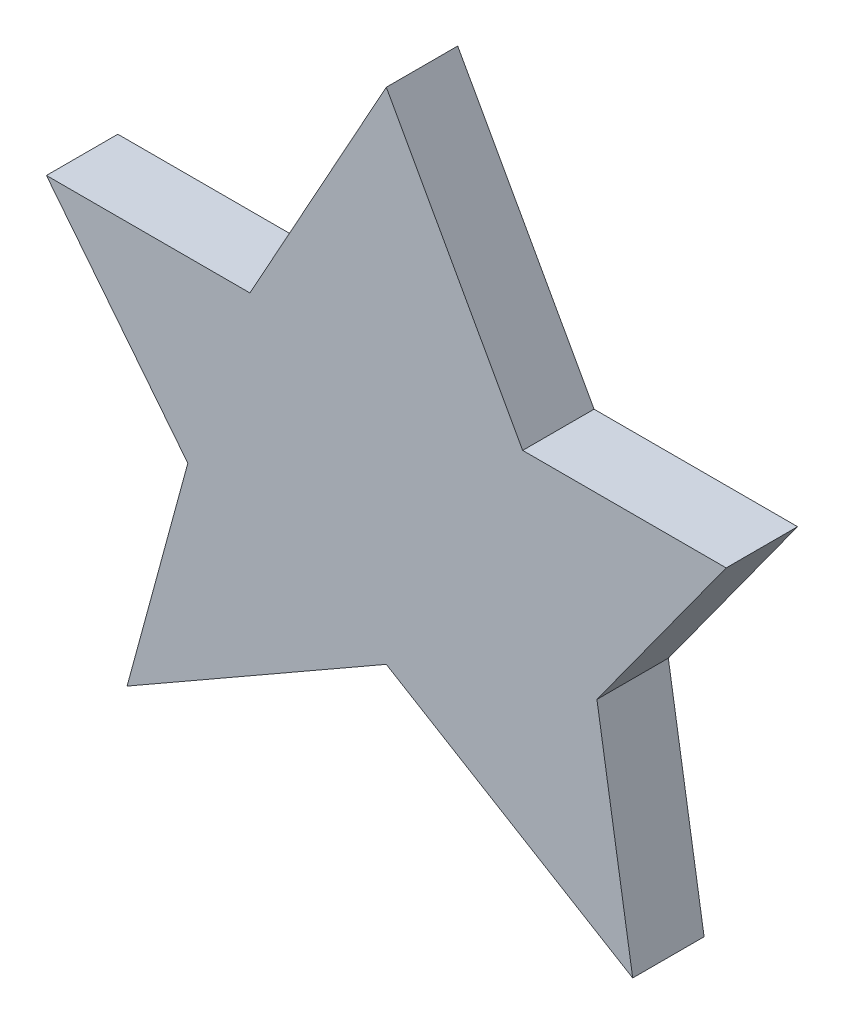
ISO-10303-21;
HEADER;
FILE_DESCRIPTION(('STEP AP214'),'2;1');
FILE_NAME('part.step','',(''),(''),'','','');
FILE_SCHEMA(('AUTOMOTIVE_DESIGN { 1 0 10303 214 1 1 1 1 }'));
ENDSEC;
DATA;
#1=APPLICATION_CONTEXT('core data for automotive mechanical design processes');
#2=APPLICATION_PROTOCOL_DEFINITION('international standard','automotive_design',2000,#1);
#3=PRODUCT_CONTEXT('',#1,'mechanical');
#4=PRODUCT('Part','Part','',(#3));
#5=PRODUCT_RELATED_PRODUCT_CATEGORY('part','',(#4));
#6=PRODUCT_DEFINITION_FORMATION('','',#4);
#7=PRODUCT_DEFINITION_CONTEXT('part definition',#1,'design');
#8=PRODUCT_DEFINITION('design','',#6,#7);
#9=PRODUCT_DEFINITION_SHAPE('','',#8);
#10=(LENGTH_UNIT() NAMED_UNIT(*) SI_UNIT(.MILLI.,.METRE.));
#11=(NAMED_UNIT(*) PLANE_ANGLE_UNIT() SI_UNIT($,.RADIAN.));
#12=(NAMED_UNIT(*) SI_UNIT($,.STERADIAN.) SOLID_ANGLE_UNIT());
#13=UNCERTAINTY_MEASURE_WITH_UNIT(LENGTH_MEASURE(1.E-05),#10,'distance_accuracy_value','');
#14=(GEOMETRIC_REPRESENTATION_CONTEXT(3) GLOBAL_UNCERTAINTY_ASSIGNED_CONTEXT((#13)) GLOBAL_UNIT_ASSIGNED_CONTEXT((#10,
#11,#12)) REPRESENTATION_CONTEXT('',''));
#15=CARTESIAN_POINT('',(0.,0.,0.));
#16=DIRECTION('',(0.,0.,1.));
#17=DIRECTION('',(1.,0.,0.));
#18=AXIS2_PLACEMENT_3D('',#15,#16,#17);
#19=CARTESIAN_POINT('',(-19.1,15.5,10.));
#20=DIRECTION('',(0.874874019677542,-0.484350544227277,0.));
#21=DIRECTION('',(0.484350544227277,0.874874019677542,0.));
#22=AXIS2_PLACEMENT_3D('',#19,#20,#21);
#23=PLANE('',#22);
#24=DIRECTION('',(-0.484350544227277,-0.874874019677542,0.));
#25=VECTOR('',#24,1.);
#26=CARTESIAN_POINT('',(-19.1,15.5,0.));
#27=LINE('',#26,#25);
#28=CARTESIAN_POINT('',(0.,50.,0.));
#29=VERTEX_POINT('',#28);
#30=CARTESIAN_POINT('',(-19.1,15.5,0.));
#31=VERTEX_POINT('',#30);
#32=EDGE_CURVE('E149',#29,#31,#27,.T.);
#33=ORIENTED_EDGE('',*,*,#32,.T.);
#34=DIRECTION('',(0.,0.,-1.));
#35=VECTOR('',#34,1.);
#36=CARTESIAN_POINT('',(-19.1,15.5,10.));
#37=LINE('',#36,#35);
#38=CARTESIAN_POINT('',(-19.1,15.5,10.));
#39=VERTEX_POINT('',#38);
#40=EDGE_CURVE('E11',#39,#31,#37,.T.);
#41=ORIENTED_EDGE('',*,*,#40,.F.);
#42=DIRECTION('',(-0.484350544227277,-0.874874019677542,0.));
#43=VECTOR('',#42,1.);
#44=CARTESIAN_POINT('',(-19.1,15.5,10.));
#45=LINE('',#44,#43);
#46=CARTESIAN_POINT('',(0.,50.,10.));
#47=VERTEX_POINT('',#46);
#48=EDGE_CURVE('E167',#47,#39,#45,.T.);
#49=ORIENTED_EDGE('',*,*,#48,.F.);
#50=DIRECTION('',(0.,0.,-1.));
#51=VECTOR('',#50,1.);
#52=CARTESIAN_POINT('',(0.,50.,10.));
#53=LINE('',#52,#51);
#54=EDGE_CURVE('E145',#47,#29,#53,.T.);
#55=ORIENTED_EDGE('',*,*,#54,.T.);
#56=EDGE_LOOP('',(#33,#41,#49,#55));
#57=FACE_BOUND('',#56,.T.);
#58=ADVANCED_FACE('F41',(#57),#23,.F.);
#59=CARTESIAN_POINT('',(-47.6,15.5,10.));
#60=DIRECTION('',(0.,-1.,0.));
#61=DIRECTION('',(0.,0.,-1.));
#62=AXIS2_PLACEMENT_3D('',#59,#60,#61);
#63=PLANE('',#62);
#64=DIRECTION('',(-1.,0.,0.));
#65=VECTOR('',#64,1.);
#66=CARTESIAN_POINT('',(-47.6,15.5,0.));
#67=LINE('',#66,#65);
#68=CARTESIAN_POINT('',(-47.6,15.5,0.));
#69=VERTEX_POINT('',#68);
#70=EDGE_CURVE('E152',#31,#69,#67,.T.);
#71=ORIENTED_EDGE('',*,*,#70,.T.);
#72=DIRECTION('',(0.,0.,-1.));
#73=VECTOR('',#72,1.);
#74=CARTESIAN_POINT('',(-47.6,15.5,10.));
#75=LINE('',#74,#73);
#76=CARTESIAN_POINT('',(-47.6,15.5,10.));
#77=VERTEX_POINT('',#76);
#78=EDGE_CURVE('E49',#77,#69,#75,.T.);
#79=ORIENTED_EDGE('',*,*,#78,.F.);
#80=DIRECTION('',(-1.,0.,0.));
#81=VECTOR('',#80,1.);
#82=CARTESIAN_POINT('',(-47.6,15.5,10.));
#83=LINE('',#82,#81);
#84=EDGE_CURVE('E106',#39,#77,#83,.T.);
#85=ORIENTED_EDGE('',*,*,#84,.F.);
#86=ORIENTED_EDGE('',*,*,#40,.T.);
#87=EDGE_LOOP('',(#71,#79,#85,#86));
#88=FACE_BOUND('',#87,.T.);
#89=ADVANCED_FACE('F216',(#88),#63,.F.);
#90=CARTESIAN_POINT('',(-27.7978709157176,-9.5,10.));
#91=DIRECTION('',(0.783886148026329,0.620904587623931,0.));
#92=DIRECTION('',(-0.620904587623931,0.783886148026329,0.));
#93=AXIS2_PLACEMENT_3D('',#90,#91,#92);
#94=PLANE('',#93);
#95=DIRECTION('',(0.620904587623931,-0.783886148026329,0.));
#96=VECTOR('',#95,1.);
#97=CARTESIAN_POINT('',(-27.7978709157176,-9.5,0.));
#98=LINE('',#97,#96);
#99=CARTESIAN_POINT('',(-27.7978709157176,-9.5,0.));
#100=VERTEX_POINT('',#99);
#101=EDGE_CURVE('E154',#69,#100,#98,.T.);
#102=ORIENTED_EDGE('',*,*,#101,.T.);
#103=DIRECTION('',(0.,0.,-1.));
#104=VECTOR('',#103,1.);
#105=CARTESIAN_POINT('',(-27.7978709157176,-9.5,10.));
#106=LINE('',#105,#104);
#107=CARTESIAN_POINT('',(-27.7978709157176,-9.5,10.));
#108=VERTEX_POINT('',#107);
#109=EDGE_CURVE('E180',#108,#100,#106,.T.);
#110=ORIENTED_EDGE('',*,*,#109,.F.);
#111=DIRECTION('',(0.620904587623931,-0.783886148026329,0.));
#112=VECTOR('',#111,1.);
#113=CARTESIAN_POINT('',(-27.7978709157176,-9.5,10.));
#114=LINE('',#113,#112);
#115=EDGE_CURVE('E188',#77,#108,#114,.T.);
#116=ORIENTED_EDGE('',*,*,#115,.F.);
#117=ORIENTED_EDGE('',*,*,#78,.T.);
#118=EDGE_LOOP('',(#102,#110,#116,#117));
#119=FACE_BOUND('',#118,.T.);
#120=ADVANCED_FACE('F186',(#119),#94,.F.);
#121=CARTESIAN_POINT('',(-36.3,-40.7867605840795,10.));
#122=DIRECTION('',(0.965003192319738,-0.262238133788193,0.));
#123=DIRECTION('',(0.262238133788193,0.965003192319738,0.));
#124=AXIS2_PLACEMENT_3D('',#121,#122,#123);
#125=PLANE('',#124);
#126=DIRECTION('',(-0.262238133788193,-0.965003192319738,0.));
#127=VECTOR('',#126,1.);
#128=CARTESIAN_POINT('',(-36.3,-40.7867605840795,0.));
#129=LINE('',#128,#127);
#130=CARTESIAN_POINT('',(-36.3,-40.7867605840795,0.));
#131=VERTEX_POINT('',#130);
#132=EDGE_CURVE('E156',#100,#131,#129,.T.);
#133=ORIENTED_EDGE('',*,*,#132,.T.);
#134=DIRECTION('',(0.,0.,-1.));
#135=VECTOR('',#134,1.);
#136=CARTESIAN_POINT('',(-36.3,-40.7867605840795,10.));
#137=LINE('',#136,#135);
#138=CARTESIAN_POINT('',(-36.3,-40.7867605840795,10.));
#139=VERTEX_POINT('',#138);
#140=EDGE_CURVE('E177',#139,#131,#137,.T.);
#141=ORIENTED_EDGE('',*,*,#140,.F.);
#142=DIRECTION('',(-0.262238133788193,-0.965003192319738,0.));
#143=VECTOR('',#142,1.);
#144=CARTESIAN_POINT('',(-36.3,-40.7867605840795,10.));
#145=LINE('',#144,#143);
#146=EDGE_CURVE('E206',#108,#139,#145,.T.);
#147=ORIENTED_EDGE('',*,*,#146,.F.);
#148=ORIENTED_EDGE('',*,*,#109,.T.);
#149=EDGE_LOOP('',(#133,#141,#147,#148));
#150=FACE_BOUND('',#149,.T.);
#151=ADVANCED_FACE('F197',(#150),#125,.F.);
#152=CARTESIAN_POINT('',(0.,-20.,10.));
#153=DIRECTION('',(-0.496929938468597,0.8677906638433,0.));
#154=DIRECTION('',(-0.8677906638433,-0.496929938468597,0.));
#155=AXIS2_PLACEMENT_3D('',#152,#153,#154);
#156=PLANE('',#155);
#157=DIRECTION('',(0.867790663843301,0.496929938468597,0.));
#158=VECTOR('',#157,1.);
#159=CARTESIAN_POINT('',(0.,-20.,0.));
#160=LINE('',#159,#158);
#161=CARTESIAN_POINT('',(0.,-20.,0.));
#162=VERTEX_POINT('',#161);
#163=EDGE_CURVE('E158',#131,#162,#160,.T.);
#164=ORIENTED_EDGE('',*,*,#163,.T.);
#165=DIRECTION('',(0.,0.,-1.));
#166=VECTOR('',#165,1.);
#167=CARTESIAN_POINT('',(0.,-20.,10.));
#168=LINE('',#167,#166);
#169=CARTESIAN_POINT('',(0.,-20.,10.));
#170=VERTEX_POINT('',#169);
#171=EDGE_CURVE('E174',#170,#162,#168,.T.);
#172=ORIENTED_EDGE('',*,*,#171,.F.);
#173=DIRECTION('',(0.867790663843301,0.496929938468597,0.));
#174=VECTOR('',#173,1.);
#175=CARTESIAN_POINT('',(0.,-20.,10.));
#176=LINE('',#175,#174);
#177=EDGE_CURVE('E203',#139,#170,#176,.T.);
#178=ORIENTED_EDGE('',*,*,#177,.F.);
#179=ORIENTED_EDGE('',*,*,#140,.T.);
#180=EDGE_LOOP('',(#164,#172,#178,#179));
#181=FACE_BOUND('',#180,.T.);
#182=ADVANCED_FACE('F201',(#181),#156,.F.);
#183=CARTESIAN_POINT('',(34.5087853371269,-40.7867605840795,10.));
#184=DIRECTION('',(0.515982321016983,0.856599232078763,0.));
#185=DIRECTION('',(-0.856599232078763,0.515982321016983,0.));
#186=AXIS2_PLACEMENT_3D('',#183,#184,#185);
#187=PLANE('',#186);
#188=DIRECTION('',(0.856599232078763,-0.515982321016983,0.));
#189=VECTOR('',#188,1.);
#190=CARTESIAN_POINT('',(34.5087853371269,-40.7867605840795,0.));
#191=LINE('',#190,#189);
#192=CARTESIAN_POINT('',(34.5087853371269,-40.7867605840795,0.));
#193=VERTEX_POINT('',#192);
#194=EDGE_CURVE('E160',#162,#193,#191,.T.);
#195=ORIENTED_EDGE('',*,*,#194,.T.);
#196=DIRECTION('',(0.,0.,-1.));
#197=VECTOR('',#196,1.);
#198=CARTESIAN_POINT('',(34.5087853371269,-40.7867605840795,10.));
#199=LINE('',#198,#197);
#200=CARTESIAN_POINT('',(34.5087853371269,-40.7867605840795,10.));
#201=VERTEX_POINT('',#200);
#202=EDGE_CURVE('E171',#201,#193,#199,.T.);
#203=ORIENTED_EDGE('',*,*,#202,.F.);
#204=DIRECTION('',(0.856599232078763,-0.515982321016983,0.));
#205=VECTOR('',#204,1.);
#206=CARTESIAN_POINT('',(34.5087853371269,-40.7867605840795,10.));
#207=LINE('',#206,#205);
#208=EDGE_CURVE('E205',#170,#201,#207,.T.);
#209=ORIENTED_EDGE('',*,*,#208,.F.);
#210=ORIENTED_EDGE('',*,*,#171,.T.);
#211=EDGE_LOOP('',(#195,#203,#209,#210));
#212=FACE_BOUND('',#211,.T.);
#213=ADVANCED_FACE('F228',(#212),#187,.F.);
#214=CARTESIAN_POINT('',(29.5,-9.5,10.));
#215=DIRECTION('',(-0.987426331384897,-0.158079853516391,0.));
#216=DIRECTION('',(0.158079853516391,-0.987426331384897,0.));
#217=AXIS2_PLACEMENT_3D('',#214,#215,#216);
#218=PLANE('',#217);
#219=DIRECTION('',(-0.158079853516391,0.987426331384897,0.));
#220=VECTOR('',#219,1.);
#221=CARTESIAN_POINT('',(29.5,-9.5,0.));
#222=LINE('',#221,#220);
#223=CARTESIAN_POINT('',(29.5,-9.5,0.));
#224=VERTEX_POINT('',#223);
#225=EDGE_CURVE('E162',#193,#224,#222,.T.);
#226=ORIENTED_EDGE('',*,*,#225,.T.);
#227=DIRECTION('',(0.,0.,-1.));
#228=VECTOR('',#227,1.);
#229=CARTESIAN_POINT('',(29.5,-9.5,10.));
#230=LINE('',#229,#228);
#231=CARTESIAN_POINT('',(29.5,-9.5,10.));
#232=VERTEX_POINT('',#231);
#233=EDGE_CURVE('E140',#232,#224,#230,.T.);
#234=ORIENTED_EDGE('',*,*,#233,.F.);
#235=DIRECTION('',(-0.158079853516391,0.987426331384897,0.));
#236=VECTOR('',#235,1.);
#237=CARTESIAN_POINT('',(29.5,-9.5,10.));
#238=LINE('',#237,#236);
#239=EDGE_CURVE('E131',#201,#232,#238,.T.);
#240=ORIENTED_EDGE('',*,*,#239,.F.);
#241=ORIENTED_EDGE('',*,*,#202,.T.);
#242=EDGE_LOOP('',(#226,#234,#240,#241));
#243=FACE_BOUND('',#242,.T.);
#244=ADVANCED_FACE('F231',(#243),#218,.F.);
#245=CARTESIAN_POINT('',(47.6,15.5,10.));
#246=DIRECTION('',(-0.809995191234823,0.586436518454012,0.));
#247=DIRECTION('',(-0.586436518454012,-0.809995191234823,0.));
#248=AXIS2_PLACEMENT_3D('',#245,#246,#247);
#249=PLANE('',#248);
#250=DIRECTION('',(0.586436518454012,0.809995191234823,0.));
#251=VECTOR('',#250,1.);
#252=CARTESIAN_POINT('',(47.6,15.5,0.));
#253=LINE('',#252,#251);
#254=CARTESIAN_POINT('',(47.6,15.5,0.));
#255=VERTEX_POINT('',#254);
#256=EDGE_CURVE('E139',#224,#255,#253,.T.);
#257=ORIENTED_EDGE('',*,*,#256,.T.);
#258=DIRECTION('',(0.,0.,-1.));
#259=VECTOR('',#258,1.);
#260=CARTESIAN_POINT('',(47.6,15.5,10.));
#261=LINE('',#260,#259);
#262=CARTESIAN_POINT('',(47.6,15.5,10.));
#263=VERTEX_POINT('',#262);
#264=EDGE_CURVE('E136',#263,#255,#261,.T.);
#265=ORIENTED_EDGE('',*,*,#264,.F.);
#266=DIRECTION('',(0.586436518454012,0.809995191234823,0.));
#267=VECTOR('',#266,1.);
#268=CARTESIAN_POINT('',(47.6,15.5,10.));
#269=LINE('',#268,#267);
#270=EDGE_CURVE('E125',#232,#263,#269,.T.);
#271=ORIENTED_EDGE('',*,*,#270,.F.);
#272=ORIENTED_EDGE('',*,*,#233,.T.);
#273=EDGE_LOOP('',(#257,#265,#271,#272));
#274=FACE_BOUND('',#273,.T.);
#275=ADVANCED_FACE('F137',(#274),#249,.F.);
#276=CARTESIAN_POINT('',(19.1,15.5,10.));
#277=DIRECTION('',(0.,-1.,0.));
#278=DIRECTION('',(0.,0.,-1.));
#279=AXIS2_PLACEMENT_3D('',#276,#277,#278);
#280=PLANE('',#279);
#281=DIRECTION('',(-1.,0.,0.));
#282=VECTOR('',#281,1.);
#283=CARTESIAN_POINT('',(19.1,15.5,0.));
#284=LINE('',#283,#282);
#285=CARTESIAN_POINT('',(19.1,15.5,0.));
#286=VERTEX_POINT('',#285);
#287=EDGE_CURVE('E92',#255,#286,#284,.T.);
#288=ORIENTED_EDGE('',*,*,#287,.T.);
#289=DIRECTION('',(0.,0.,-1.));
#290=VECTOR('',#289,1.);
#291=CARTESIAN_POINT('',(19.1,15.5,10.));
#292=LINE('',#291,#290);
#293=CARTESIAN_POINT('',(19.1,15.5,10.));
#294=VERTEX_POINT('',#293);
#295=EDGE_CURVE('E141',#294,#286,#292,.T.);
#296=ORIENTED_EDGE('',*,*,#295,.F.);
#297=DIRECTION('',(-1.,0.,0.));
#298=VECTOR('',#297,1.);
#299=CARTESIAN_POINT('',(19.1,15.5,10.));
#300=LINE('',#299,#298);
#301=EDGE_CURVE('E129',#263,#294,#300,.T.);
#302=ORIENTED_EDGE('',*,*,#301,.F.);
#303=ORIENTED_EDGE('',*,*,#264,.T.);
#304=EDGE_LOOP('',(#288,#296,#302,#303));
#305=FACE_BOUND('',#304,.T.);
#306=ADVANCED_FACE('F143',(#305),#280,.F.);
#307=CARTESIAN_POINT('',(0.,50.,10.));
#308=DIRECTION('',(-0.874874019677542,-0.484350544227277,0.));
#309=DIRECTION('',(0.484350544227277,-0.874874019677542,0.));
#310=AXIS2_PLACEMENT_3D('',#307,#308,#309);
#311=PLANE('',#310);
#312=DIRECTION('',(-0.484350544227277,0.874874019677542,0.));
#313=VECTOR('',#312,1.);
#314=CARTESIAN_POINT('',(0.,50.,0.));
#315=LINE('',#314,#313);
#316=EDGE_CURVE('E98',#286,#29,#315,.T.);
#317=ORIENTED_EDGE('',*,*,#316,.T.);
#318=ORIENTED_EDGE('',*,*,#54,.F.);
#319=DIRECTION('',(-0.484350544227277,0.874874019677542,0.));
#320=VECTOR('',#319,1.);
#321=CARTESIAN_POINT('',(0.,50.,10.));
#322=LINE('',#321,#320);
#323=EDGE_CURVE('E57',#294,#47,#322,.T.);
#324=ORIENTED_EDGE('',*,*,#323,.F.);
#325=ORIENTED_EDGE('',*,*,#295,.T.);
#326=EDGE_LOOP('',(#317,#318,#324,#325));
#327=FACE_BOUND('',#326,.T.);
#328=ADVANCED_FACE('F240',(#327),#311,.F.);
#329=CARTESIAN_POINT('',(0.,0.,10.));
#330=DIRECTION('',(0.,0.,1.));
#331=DIRECTION('',(1.,0.,0.));
#332=AXIS2_PLACEMENT_3D('',#329,#330,#331);
#333=PLANE('',#332);
#334=ORIENTED_EDGE('',*,*,#48,.T.);
#335=ORIENTED_EDGE('',*,*,#84,.T.);
#336=ORIENTED_EDGE('',*,*,#115,.T.);
#337=ORIENTED_EDGE('',*,*,#146,.T.);
#338=ORIENTED_EDGE('',*,*,#177,.T.);
#339=ORIENTED_EDGE('',*,*,#208,.T.);
#340=ORIENTED_EDGE('',*,*,#239,.T.);
#341=ORIENTED_EDGE('',*,*,#270,.T.);
#342=ORIENTED_EDGE('',*,*,#301,.T.);
#343=ORIENTED_EDGE('',*,*,#323,.T.);
#344=EDGE_LOOP('',(#334,#335,#336,#337,#338,#339,#340,#341,#342,#343));
#345=FACE_BOUND('',#344,.T.);
#346=ADVANCED_FACE('F127',(#345),#333,.T.);
#347=CARTESIAN_POINT('',(0.,0.,0.));
#348=DIRECTION('',(0.,0.,1.));
#349=DIRECTION('',(1.,0.,0.));
#350=AXIS2_PLACEMENT_3D('',#347,#348,#349);
#351=PLANE('',#350);
#352=ORIENTED_EDGE('',*,*,#32,.F.);
#353=ORIENTED_EDGE('',*,*,#316,.F.);
#354=ORIENTED_EDGE('',*,*,#287,.F.);
#355=ORIENTED_EDGE('',*,*,#256,.F.);
#356=ORIENTED_EDGE('',*,*,#225,.F.);
#357=ORIENTED_EDGE('',*,*,#194,.F.);
#358=ORIENTED_EDGE('',*,*,#163,.F.);
#359=ORIENTED_EDGE('',*,*,#132,.F.);
#360=ORIENTED_EDGE('',*,*,#101,.F.);
#361=ORIENTED_EDGE('',*,*,#70,.F.);
#362=EDGE_LOOP('',(#352,#353,#354,#355,#356,#357,#358,#359,#360,#361));
#363=FACE_BOUND('',#362,.T.);
#364=ADVANCED_FACE('F192',(#363),#351,.F.);
#365=CLOSED_SHELL('',(#58,#89,#120,#151,#182,#213,#244,#275,#306,#328,#346,#364));
#366=MANIFOLD_SOLID_BREP('B2',#365);
#367=ADVANCED_BREP_SHAPE_REPRESENTATION('',(#18,#366),#14);
#368=SHAPE_DEFINITION_REPRESENTATION(#9,#367);
ENDSEC;
END-ISO-10303-21;
